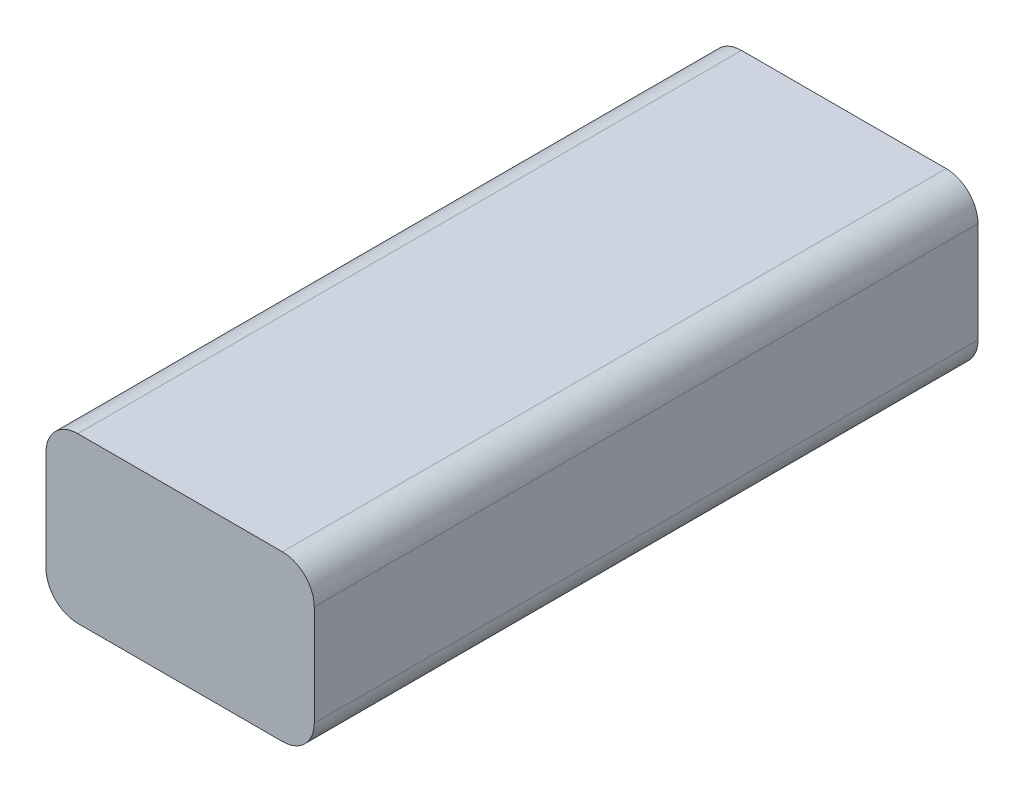
ISO-10303-21;
HEADER;
FILE_DESCRIPTION(('STEP AP214'),'2;1');
FILE_NAME('part.step','',(''),(''),'','','');
FILE_SCHEMA(('AUTOMOTIVE_DESIGN { 1 0 10303 214 1 1 1 1 }'));
ENDSEC;
DATA;
#1=APPLICATION_CONTEXT('core data for automotive mechanical design processes');
#2=APPLICATION_PROTOCOL_DEFINITION('international standard','automotive_design',2000,#1);
#3=PRODUCT_CONTEXT('',#1,'mechanical');
#4=PRODUCT('Part','Part','',(#3));
#5=PRODUCT_RELATED_PRODUCT_CATEGORY('part','',(#4));
#6=PRODUCT_DEFINITION_FORMATION('','',#4);
#7=PRODUCT_DEFINITION_CONTEXT('part definition',#1,'design');
#8=PRODUCT_DEFINITION('design','',#6,#7);
#9=PRODUCT_DEFINITION_SHAPE('','',#8);
#10=(LENGTH_UNIT() NAMED_UNIT(*) SI_UNIT(.MILLI.,.METRE.));
#11=(NAMED_UNIT(*) PLANE_ANGLE_UNIT() SI_UNIT($,.RADIAN.));
#12=(NAMED_UNIT(*) SI_UNIT($,.STERADIAN.) SOLID_ANGLE_UNIT());
#13=UNCERTAINTY_MEASURE_WITH_UNIT(LENGTH_MEASURE(1.E-05),#10,'distance_accuracy_value','');
#14=(GEOMETRIC_REPRESENTATION_CONTEXT(3) GLOBAL_UNCERTAINTY_ASSIGNED_CONTEXT((#13)) GLOBAL_UNIT_ASSIGNED_CONTEXT((#10,
#11,#12)) REPRESENTATION_CONTEXT('',''));
#15=CARTESIAN_POINT('',(0.,0.,0.));
#16=DIRECTION('',(0.,0.,1.));
#17=DIRECTION('',(1.,0.,0.));
#18=AXIS2_PLACEMENT_3D('',#15,#16,#17);
#19=CARTESIAN_POINT('',(-12.65,15.5,-31.3));
#20=DIRECTION('',(1.,0.,0.));
#21=DIRECTION('',(0.,0.,-1.));
#22=AXIS2_PLACEMENT_3D('',#19,#20,#21);
#23=PLANE('',#22);
#24=DIRECTION('',(0.,-1.,0.));
#25=VECTOR('',#24,1.);
#26=CARTESIAN_POINT('',(-12.65,15.5,-31.3));
#27=LINE('',#26,#25);
#28=CARTESIAN_POINT('',(-12.65,12.5,-31.3));
#29=VERTEX_POINT('',#28);
#30=CARTESIAN_POINT('',(-12.65,3.,-31.3));
#31=VERTEX_POINT('',#30);
#32=EDGE_CURVE('E177',#29,#31,#27,.T.);
#33=ORIENTED_EDGE('',*,*,#32,.T.);
#34=DIRECTION('',(0.,0.,1.));
#35=VECTOR('',#34,1.);
#36=CARTESIAN_POINT('',(-12.65,3.,-31.3));
#37=LINE('',#36,#35);
#38=CARTESIAN_POINT('',(-12.65,3.,31.3));
#39=VERTEX_POINT('',#38);
#40=EDGE_CURVE('E195',#31,#39,#37,.T.);
#41=ORIENTED_EDGE('',*,*,#40,.T.);
#42=DIRECTION('',(0.,-1.,0.));
#43=VECTOR('',#42,1.);
#44=CARTESIAN_POINT('',(-12.65,15.5,31.3));
#45=LINE('',#44,#43);
#46=CARTESIAN_POINT('',(-12.65,12.5,31.3));
#47=VERTEX_POINT('',#46);
#48=EDGE_CURVE('E190',#47,#39,#45,.T.);
#49=ORIENTED_EDGE('',*,*,#48,.F.);
#50=DIRECTION('',(0.,0.,1.));
#51=VECTOR('',#50,1.);
#52=CARTESIAN_POINT('',(-12.65,12.5,-31.3));
#53=LINE('',#52,#51);
#54=EDGE_CURVE('E193',#47,#29,#53,.F.);
#55=ORIENTED_EDGE('',*,*,#54,.T.);
#56=EDGE_LOOP('',(#33,#41,#49,#55));
#57=FACE_BOUND('',#56,.T.);
#58=ADVANCED_FACE('F39',(#57),#23,.F.);
#59=CARTESIAN_POINT('',(-12.65,15.5,31.3));
#60=DIRECTION('',(0.,0.,-1.));
#61=DIRECTION('',(-1.,0.,0.));
#62=AXIS2_PLACEMENT_3D('',#59,#60,#61);
#63=PLANE('',#62);
#64=ORIENTED_EDGE('',*,*,#48,.T.);
#65=CARTESIAN_POINT('',(-9.65,3.,31.3));
#66=DIRECTION('',(0.,0.,-1.));
#67=DIRECTION('',(-1.,0.,0.));
#68=AXIS2_PLACEMENT_3D('',#65,#66,#67);
#69=CIRCLE('',#68,3.);
#70=CARTESIAN_POINT('',(-9.65,0.,31.3));
#71=VERTEX_POINT('',#70);
#72=EDGE_CURVE('E204',#39,#71,#69,.F.);
#73=ORIENTED_EDGE('',*,*,#72,.T.);
#74=DIRECTION('',(1.,0.,0.));
#75=VECTOR('',#74,1.);
#76=CARTESIAN_POINT('',(-12.65,0.,31.3));
#77=LINE('',#76,#75);
#78=CARTESIAN_POINT('',(9.65,0.,31.3));
#79=VERTEX_POINT('',#78);
#80=EDGE_CURVE('E166',#71,#79,#77,.T.);
#81=ORIENTED_EDGE('',*,*,#80,.T.);
#82=CARTESIAN_POINT('',(9.65,3.,31.3));
#83=DIRECTION('',(0.,0.,-1.));
#84=DIRECTION('',(-1.,0.,0.));
#85=AXIS2_PLACEMENT_3D('',#82,#83,#84);
#86=CIRCLE('',#85,3.);
#87=CARTESIAN_POINT('',(12.65,3.,31.3));
#88=VERTEX_POINT('',#87);
#89=EDGE_CURVE('E202',#79,#88,#86,.F.);
#90=ORIENTED_EDGE('',*,*,#89,.T.);
#91=DIRECTION('',(0.,-1.,0.));
#92=VECTOR('',#91,1.);
#93=CARTESIAN_POINT('',(12.65,15.5,31.3));
#94=LINE('',#93,#92);
#95=CARTESIAN_POINT('',(12.65,12.5,31.3));
#96=VERTEX_POINT('',#95);
#97=EDGE_CURVE('E187',#96,#88,#94,.T.);
#98=ORIENTED_EDGE('',*,*,#97,.F.);
#99=CARTESIAN_POINT('',(9.65,12.5,31.3));
#100=DIRECTION('',(0.,0.,-1.));
#101=DIRECTION('',(-1.,0.,0.));
#102=AXIS2_PLACEMENT_3D('',#99,#100,#101);
#103=CIRCLE('',#102,3.);
#104=CARTESIAN_POINT('',(9.65,15.5,31.3));
#105=VERTEX_POINT('',#104);
#106=EDGE_CURVE('E198',#96,#105,#103,.F.);
#107=ORIENTED_EDGE('',*,*,#106,.T.);
#108=DIRECTION('',(1.,0.,0.));
#109=VECTOR('',#108,1.);
#110=CARTESIAN_POINT('',(-12.65,15.5,31.3));
#111=LINE('',#110,#109);
#112=CARTESIAN_POINT('',(-9.65,15.5,31.3));
#113=VERTEX_POINT('',#112);
#114=EDGE_CURVE('E170',#113,#105,#111,.T.);
#115=ORIENTED_EDGE('',*,*,#114,.F.);
#116=CARTESIAN_POINT('',(-9.65,12.5,31.3));
#117=DIRECTION('',(0.,0.,-1.));
#118=DIRECTION('',(-1.,0.,0.));
#119=AXIS2_PLACEMENT_3D('',#116,#117,#118);
#120=CIRCLE('',#119,3.);
#121=EDGE_CURVE('E200',#113,#47,#120,.F.);
#122=ORIENTED_EDGE('',*,*,#121,.T.);
#123=EDGE_LOOP('',(#64,#73,#81,#90,#98,#107,#115,#122));
#124=FACE_BOUND('',#123,.T.);
#125=ADVANCED_FACE('F238',(#124),#63,.F.);
#126=CARTESIAN_POINT('',(12.65,15.5,31.3));
#127=DIRECTION('',(-1.,0.,0.));
#128=DIRECTION('',(0.,0.,1.));
#129=AXIS2_PLACEMENT_3D('',#126,#127,#128);
#130=PLANE('',#129);
#131=ORIENTED_EDGE('',*,*,#97,.T.);
#132=DIRECTION('',(0.,0.,-1.));
#133=VECTOR('',#132,1.);
#134=CARTESIAN_POINT('',(12.65,3.,31.3));
#135=LINE('',#134,#133);
#136=CARTESIAN_POINT('',(12.65,3.,-31.3));
#137=VERTEX_POINT('',#136);
#138=EDGE_CURVE('E219',#88,#137,#135,.T.);
#139=ORIENTED_EDGE('',*,*,#138,.T.);
#140=DIRECTION('',(0.,-1.,0.));
#141=VECTOR('',#140,1.);
#142=CARTESIAN_POINT('',(12.65,15.5,-31.3));
#143=LINE('',#142,#141);
#144=CARTESIAN_POINT('',(12.65,12.5,-31.3));
#145=VERTEX_POINT('',#144);
#146=EDGE_CURVE('E184',#145,#137,#143,.T.);
#147=ORIENTED_EDGE('',*,*,#146,.F.);
#148=DIRECTION('',(0.,0.,-1.));
#149=VECTOR('',#148,1.);
#150=CARTESIAN_POINT('',(12.65,12.5,31.3));
#151=LINE('',#150,#149);
#152=EDGE_CURVE('E217',#145,#96,#151,.F.);
#153=ORIENTED_EDGE('',*,*,#152,.T.);
#154=EDGE_LOOP('',(#131,#139,#147,#153));
#155=FACE_BOUND('',#154,.T.);
#156=ADVANCED_FACE('F243',(#155),#130,.F.);
#157=CARTESIAN_POINT('',(12.65,15.5,-31.3));
#158=DIRECTION('',(0.,0.,1.));
#159=DIRECTION('',(1.,0.,0.));
#160=AXIS2_PLACEMENT_3D('',#157,#158,#159);
#161=PLANE('',#160);
#162=DIRECTION('',(-1.,0.,0.));
#163=VECTOR('',#162,1.);
#164=CARTESIAN_POINT('',(12.65,0.,-31.3));
#165=LINE('',#164,#163);
#166=CARTESIAN_POINT('',(9.65,0.,-31.3));
#167=VERTEX_POINT('',#166);
#168=CARTESIAN_POINT('',(-9.65,0.,-31.3));
#169=VERTEX_POINT('',#168);
#170=EDGE_CURVE('E174',#167,#169,#165,.T.);
#171=ORIENTED_EDGE('',*,*,#170,.T.);
#172=CARTESIAN_POINT('',(-9.65,3.,-31.3));
#173=DIRECTION('',(0.,0.,1.));
#174=DIRECTION('',(1.,0.,0.));
#175=AXIS2_PLACEMENT_3D('',#172,#173,#174);
#176=CIRCLE('',#175,3.);
#177=EDGE_CURVE('E215',#169,#31,#176,.F.);
#178=ORIENTED_EDGE('',*,*,#177,.T.);
#179=ORIENTED_EDGE('',*,*,#32,.F.);
#180=CARTESIAN_POINT('',(-9.65,12.5,-31.3));
#181=DIRECTION('',(0.,0.,1.));
#182=DIRECTION('',(1.,0.,0.));
#183=AXIS2_PLACEMENT_3D('',#180,#181,#182);
#184=CIRCLE('',#183,3.);
#185=CARTESIAN_POINT('',(-9.65,15.5,-31.3));
#186=VERTEX_POINT('',#185);
#187=EDGE_CURVE('E212',#29,#186,#184,.F.);
#188=ORIENTED_EDGE('',*,*,#187,.T.);
#189=DIRECTION('',(-1.,0.,0.));
#190=VECTOR('',#189,1.);
#191=CARTESIAN_POINT('',(12.65,15.5,-31.3));
#192=LINE('',#191,#190);
#193=CARTESIAN_POINT('',(9.65,15.5,-31.3));
#194=VERTEX_POINT('',#193);
#195=EDGE_CURVE('E173',#194,#186,#192,.T.);
#196=ORIENTED_EDGE('',*,*,#195,.F.);
#197=CARTESIAN_POINT('',(9.65,12.5,-31.3));
#198=DIRECTION('',(0.,0.,1.));
#199=DIRECTION('',(1.,0.,0.));
#200=AXIS2_PLACEMENT_3D('',#197,#198,#199);
#201=CIRCLE('',#200,3.);
#202=EDGE_CURVE('E210',#194,#145,#201,.F.);
#203=ORIENTED_EDGE('',*,*,#202,.T.);
#204=ORIENTED_EDGE('',*,*,#146,.T.);
#205=CARTESIAN_POINT('',(9.65,3.,-31.3));
#206=DIRECTION('',(0.,0.,1.));
#207=DIRECTION('',(1.,0.,0.));
#208=AXIS2_PLACEMENT_3D('',#205,#206,#207);
#209=CIRCLE('',#208,3.);
#210=EDGE_CURVE('E62',#137,#167,#209,.F.);
#211=ORIENTED_EDGE('',*,*,#210,.T.);
#212=EDGE_LOOP('',(#171,#178,#179,#188,#196,#203,#204,#211));
#213=FACE_BOUND('',#212,.T.);
#214=ADVANCED_FACE('F230',(#213),#161,.F.);
#215=CARTESIAN_POINT('',(0.,15.5,0.));
#216=DIRECTION('',(0.,1.,0.));
#217=DIRECTION('',(0.,0.,1.));
#218=AXIS2_PLACEMENT_3D('',#215,#216,#217);
#219=PLANE('',#218);
#220=ORIENTED_EDGE('',*,*,#195,.T.);
#221=DIRECTION('',(0.,0.,1.));
#222=VECTOR('',#221,1.);
#223=CARTESIAN_POINT('',(-9.65,15.5,31.3));
#224=LINE('',#223,#222);
#225=EDGE_CURVE('E11',#186,#113,#224,.T.);
#226=ORIENTED_EDGE('',*,*,#225,.T.);
#227=ORIENTED_EDGE('',*,*,#114,.T.);
#228=DIRECTION('',(0.,0.,-1.));
#229=VECTOR('',#228,1.);
#230=CARTESIAN_POINT('',(9.65,15.5,-31.3));
#231=LINE('',#230,#229);
#232=EDGE_CURVE('E47',#105,#194,#231,.T.);
#233=ORIENTED_EDGE('',*,*,#232,.T.);
#234=EDGE_LOOP('',(#220,#226,#227,#233));
#235=FACE_BOUND('',#234,.T.);
#236=ADVANCED_FACE('F224',(#235),#219,.T.);
#237=CARTESIAN_POINT('',(0.,0.,0.));
#238=DIRECTION('',(0.,1.,0.));
#239=DIRECTION('',(0.,0.,1.));
#240=AXIS2_PLACEMENT_3D('',#237,#238,#239);
#241=PLANE('',#240);
#242=DIRECTION('',(-1.,0.,0.));
#243=VECTOR('',#242,1.);
#244=CARTESIAN_POINT('',(-1.5,0.,-26.8));
#245=LINE('',#244,#243);
#246=CARTESIAN_POINT('',(1.5,0.,-26.8));
#247=VERTEX_POINT('',#246);
#248=CARTESIAN_POINT('',(-1.5,0.,-26.8));
#249=VERTEX_POINT('',#248);
#250=EDGE_CURVE('E154',#247,#249,#245,.T.);
#251=ORIENTED_EDGE('',*,*,#250,.T.);
#252=DIRECTION('',(0.,0.,1.));
#253=VECTOR('',#252,1.);
#254=CARTESIAN_POINT('',(-1.5,0.,-23.8));
#255=LINE('',#254,#253);
#256=CARTESIAN_POINT('',(-1.5,0.,-23.8));
#257=VERTEX_POINT('',#256);
#258=EDGE_CURVE('E161',#249,#257,#255,.T.);
#259=ORIENTED_EDGE('',*,*,#258,.T.);
#260=DIRECTION('',(1.,0.,0.));
#261=VECTOR('',#260,1.);
#262=CARTESIAN_POINT('',(1.5,0.,-23.8));
#263=LINE('',#262,#261);
#264=CARTESIAN_POINT('',(1.5,0.,-23.8));
#265=VERTEX_POINT('',#264);
#266=EDGE_CURVE('E134',#257,#265,#263,.T.);
#267=ORIENTED_EDGE('',*,*,#266,.T.);
#268=DIRECTION('',(0.,0.,-1.));
#269=VECTOR('',#268,1.);
#270=CARTESIAN_POINT('',(1.5,0.,-26.8));
#271=LINE('',#270,#269);
#272=EDGE_CURVE('E54',#265,#247,#271,.T.);
#273=ORIENTED_EDGE('',*,*,#272,.T.);
#274=EDGE_LOOP('',(#251,#259,#267,#273));
#275=FACE_BOUND('',#274,.T.);
#276=ORIENTED_EDGE('',*,*,#80,.F.);
#277=DIRECTION('',(0.,0.,1.));
#278=VECTOR('',#277,1.);
#279=CARTESIAN_POINT('',(-9.65,0.,0.));
#280=LINE('',#279,#278);
#281=EDGE_CURVE('E208',#71,#169,#280,.F.);
#282=ORIENTED_EDGE('',*,*,#281,.T.);
#283=ORIENTED_EDGE('',*,*,#170,.F.);
#284=DIRECTION('',(0.,0.,-1.));
#285=VECTOR('',#284,1.);
#286=CARTESIAN_POINT('',(9.65,0.,0.));
#287=LINE('',#286,#285);
#288=EDGE_CURVE('E206',#167,#79,#287,.F.);
#289=ORIENTED_EDGE('',*,*,#288,.T.);
#290=EDGE_LOOP('',(#276,#282,#283,#289));
#291=FACE_BOUND('',#290,.T.);
#292=ADVANCED_FACE('F248',(#275,#291),#241,.F.);
#293=CARTESIAN_POINT('',(-9.65,3.,-31.3));
#294=DIRECTION('',(0.,0.,1.));
#295=DIRECTION('',(1.,0.,0.));
#296=AXIS2_PLACEMENT_3D('',#293,#294,#295);
#297=CYLINDRICAL_SURFACE('',#296,3.);
#298=ORIENTED_EDGE('',*,*,#177,.F.);
#299=ORIENTED_EDGE('',*,*,#281,.F.);
#300=ORIENTED_EDGE('',*,*,#72,.F.);
#301=ORIENTED_EDGE('',*,*,#40,.F.);
#302=EDGE_LOOP('',(#298,#299,#300,#301));
#303=FACE_BOUND('',#302,.T.);
#304=ADVANCED_FACE('F253',(#303),#297,.T.);
#305=CARTESIAN_POINT('',(9.65,3.,31.3));
#306=DIRECTION('',(0.,0.,-1.));
#307=DIRECTION('',(-1.,0.,0.));
#308=AXIS2_PLACEMENT_3D('',#305,#306,#307);
#309=CYLINDRICAL_SURFACE('',#308,3.);
#310=ORIENTED_EDGE('',*,*,#89,.F.);
#311=ORIENTED_EDGE('',*,*,#288,.F.);
#312=ORIENTED_EDGE('',*,*,#210,.F.);
#313=ORIENTED_EDGE('',*,*,#138,.F.);
#314=EDGE_LOOP('',(#310,#311,#312,#313));
#315=FACE_BOUND('',#314,.T.);
#316=ADVANCED_FACE('F251',(#315),#309,.T.);
#317=CARTESIAN_POINT('',(-9.65,12.5,0.));
#318=DIRECTION('',(0.,0.,-1.));
#319=DIRECTION('',(-1.,0.,0.));
#320=AXIS2_PLACEMENT_3D('',#317,#318,#319);
#321=CYLINDRICAL_SURFACE('',#320,3.);
#322=ORIENTED_EDGE('',*,*,#187,.F.);
#323=ORIENTED_EDGE('',*,*,#54,.F.);
#324=ORIENTED_EDGE('',*,*,#121,.F.);
#325=ORIENTED_EDGE('',*,*,#225,.F.);
#326=EDGE_LOOP('',(#322,#323,#324,#325));
#327=FACE_BOUND('',#326,.T.);
#328=ADVANCED_FACE('F236',(#327),#321,.T.);
#329=CARTESIAN_POINT('',(9.65,12.5,0.));
#330=DIRECTION('',(0.,0.,1.));
#331=DIRECTION('',(1.,0.,0.));
#332=AXIS2_PLACEMENT_3D('',#329,#330,#331);
#333=CYLINDRICAL_SURFACE('',#332,3.);
#334=ORIENTED_EDGE('',*,*,#106,.F.);
#335=ORIENTED_EDGE('',*,*,#152,.F.);
#336=ORIENTED_EDGE('',*,*,#202,.F.);
#337=ORIENTED_EDGE('',*,*,#232,.F.);
#338=EDGE_LOOP('',(#334,#335,#336,#337));
#339=FACE_BOUND('',#338,.T.);
#340=ADVANCED_FACE('F41',(#339),#333,.T.);
#341=CARTESIAN_POINT('',(-1.5,-1.3,-23.8));
#342=DIRECTION('',(-1.,0.,0.));
#343=DIRECTION('',(0.,0.,1.));
#344=AXIS2_PLACEMENT_3D('',#341,#342,#343);
#345=PLANE('',#344);
#346=ORIENTED_EDGE('',*,*,#258,.F.);
#347=DIRECTION('',(0.,1.,0.));
#348=VECTOR('',#347,1.);
#349=CARTESIAN_POINT('',(-1.5,-1.3,-26.8));
#350=LINE('',#349,#348);
#351=CARTESIAN_POINT('',(-1.5,-1.3,-26.8));
#352=VERTEX_POINT('',#351);
#353=EDGE_CURVE('E153',#352,#249,#350,.T.);
#354=ORIENTED_EDGE('',*,*,#353,.F.);
#355=DIRECTION('',(0.,0.,1.));
#356=VECTOR('',#355,1.);
#357=CARTESIAN_POINT('',(-1.5,-1.3,-23.8));
#358=LINE('',#357,#356);
#359=CARTESIAN_POINT('',(-1.5,-1.3,-23.8));
#360=VERTEX_POINT('',#359);
#361=EDGE_CURVE('E147',#352,#360,#358,.T.);
#362=ORIENTED_EDGE('',*,*,#361,.T.);
#363=DIRECTION('',(0.,1.,0.));
#364=VECTOR('',#363,1.);
#365=CARTESIAN_POINT('',(-1.5,-1.3,-23.8));
#366=LINE('',#365,#364);
#367=EDGE_CURVE('E129',#360,#257,#366,.T.);
#368=ORIENTED_EDGE('',*,*,#367,.T.);
#369=EDGE_LOOP('',(#346,#354,#362,#368));
#370=FACE_BOUND('',#369,.T.);
#371=ADVANCED_FACE('F152',(#370),#345,.T.);
#372=CARTESIAN_POINT('',(-1.5,-1.3,-26.8));
#373=DIRECTION('',(0.,0.,-1.));
#374=DIRECTION('',(-1.,0.,0.));
#375=AXIS2_PLACEMENT_3D('',#372,#373,#374);
#376=PLANE('',#375);
#377=ORIENTED_EDGE('',*,*,#250,.F.);
#378=DIRECTION('',(0.,1.,0.));
#379=VECTOR('',#378,1.);
#380=CARTESIAN_POINT('',(1.5,-1.3,-26.8));
#381=LINE('',#380,#379);
#382=CARTESIAN_POINT('',(1.5,-1.3,-26.8));
#383=VERTEX_POINT('',#382);
#384=EDGE_CURVE('E167',#383,#247,#381,.T.);
#385=ORIENTED_EDGE('',*,*,#384,.F.);
#386=DIRECTION('',(-1.,0.,0.));
#387=VECTOR('',#386,1.);
#388=CARTESIAN_POINT('',(-1.5,-1.3,-26.8));
#389=LINE('',#388,#387);
#390=EDGE_CURVE('E140',#383,#352,#389,.T.);
#391=ORIENTED_EDGE('',*,*,#390,.T.);
#392=ORIENTED_EDGE('',*,*,#353,.T.);
#393=EDGE_LOOP('',(#377,#385,#391,#392));
#394=FACE_BOUND('',#393,.T.);
#395=ADVANCED_FACE('F275',(#394),#376,.T.);
#396=CARTESIAN_POINT('',(1.5,-1.3,-26.8));
#397=DIRECTION('',(1.,0.,0.));
#398=DIRECTION('',(0.,0.,-1.));
#399=AXIS2_PLACEMENT_3D('',#396,#397,#398);
#400=PLANE('',#399);
#401=ORIENTED_EDGE('',*,*,#272,.F.);
#402=DIRECTION('',(0.,1.,0.));
#403=VECTOR('',#402,1.);
#404=CARTESIAN_POINT('',(1.5,-1.3,-23.8));
#405=LINE('',#404,#403);
#406=CARTESIAN_POINT('',(1.5,-1.3,-23.8));
#407=VERTEX_POINT('',#406);
#408=EDGE_CURVE('E139',#407,#265,#405,.T.);
#409=ORIENTED_EDGE('',*,*,#408,.F.);
#410=DIRECTION('',(0.,0.,-1.));
#411=VECTOR('',#410,1.);
#412=CARTESIAN_POINT('',(1.5,-1.3,-26.8));
#413=LINE('',#412,#411);
#414=EDGE_CURVE('E150',#407,#383,#413,.T.);
#415=ORIENTED_EDGE('',*,*,#414,.T.);
#416=ORIENTED_EDGE('',*,*,#384,.T.);
#417=EDGE_LOOP('',(#401,#409,#415,#416));
#418=FACE_BOUND('',#417,.T.);
#419=ADVANCED_FACE('F280',(#418),#400,.T.);
#420=CARTESIAN_POINT('',(1.5,-1.3,-23.8));
#421=DIRECTION('',(0.,0.,1.));
#422=DIRECTION('',(1.,0.,0.));
#423=AXIS2_PLACEMENT_3D('',#420,#421,#422);
#424=PLANE('',#423);
#425=ORIENTED_EDGE('',*,*,#266,.F.);
#426=ORIENTED_EDGE('',*,*,#367,.F.);
#427=DIRECTION('',(1.,0.,0.));
#428=VECTOR('',#427,1.);
#429=CARTESIAN_POINT('',(1.5,-1.3,-23.8));
#430=LINE('',#429,#428);
#431=EDGE_CURVE('E132',#360,#407,#430,.T.);
#432=ORIENTED_EDGE('',*,*,#431,.T.);
#433=ORIENTED_EDGE('',*,*,#408,.T.);
#434=EDGE_LOOP('',(#425,#426,#432,#433));
#435=FACE_BOUND('',#434,.T.);
#436=ADVANCED_FACE('F131',(#435),#424,.T.);
#437=CARTESIAN_POINT('',(0.,-1.3,0.));
#438=DIRECTION('',(0.,-1.,0.));
#439=DIRECTION('',(0.,0.,-1.));
#440=AXIS2_PLACEMENT_3D('',#437,#438,#439);
#441=PLANE('',#440);
#442=ORIENTED_EDGE('',*,*,#361,.F.);
#443=ORIENTED_EDGE('',*,*,#390,.F.);
#444=ORIENTED_EDGE('',*,*,#414,.F.);
#445=ORIENTED_EDGE('',*,*,#431,.F.);
#446=EDGE_LOOP('',(#442,#443,#444,#445));
#447=FACE_BOUND('',#446,.T.);
#448=ADVANCED_FACE('F145',(#447),#441,.T.);
#449=CLOSED_SHELL('',(#58,#125,#156,#214,#236,#292,#304,#316,#328,#340,#371,#395,#419,#436,#448));
#450=MANIFOLD_SOLID_BREP('B2',#449);
#451=ADVANCED_BREP_SHAPE_REPRESENTATION('',(#18,#450),#14);
#452=SHAPE_DEFINITION_REPRESENTATION(#9,#451);
ENDSEC;
END-ISO-10303-21;
